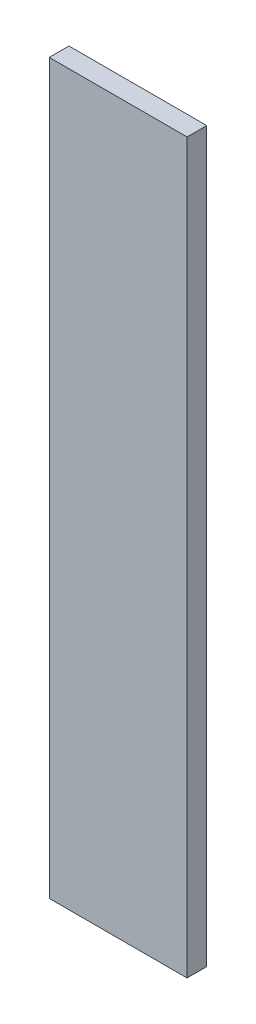
ISO-10303-21;
HEADER;
FILE_DESCRIPTION(('STEP AP214'),'2;1');
FILE_NAME('part.step','',(''),(''),'','','');
FILE_SCHEMA(('AUTOMOTIVE_DESIGN { 1 0 10303 214 1 1 1 1 }'));
ENDSEC;
DATA;
#1=APPLICATION_CONTEXT('core data for automotive mechanical design processes');
#2=APPLICATION_PROTOCOL_DEFINITION('international standard','automotive_design',2000,#1);
#3=PRODUCT_CONTEXT('',#1,'mechanical');
#4=PRODUCT('Part','Part','',(#3));
#5=PRODUCT_RELATED_PRODUCT_CATEGORY('part','',(#4));
#6=PRODUCT_DEFINITION_FORMATION('','',#4);
#7=PRODUCT_DEFINITION_CONTEXT('part definition',#1,'design');
#8=PRODUCT_DEFINITION('design','',#6,#7);
#9=PRODUCT_DEFINITION_SHAPE('','',#8);
#10=(LENGTH_UNIT() NAMED_UNIT(*) SI_UNIT(.MILLI.,.METRE.));
#11=(NAMED_UNIT(*) PLANE_ANGLE_UNIT() SI_UNIT($,.RADIAN.));
#12=(NAMED_UNIT(*) SI_UNIT($,.STERADIAN.) SOLID_ANGLE_UNIT());
#13=UNCERTAINTY_MEASURE_WITH_UNIT(LENGTH_MEASURE(1.E-05),#10,'distance_accuracy_value','');
#14=(GEOMETRIC_REPRESENTATION_CONTEXT(3) GLOBAL_UNCERTAINTY_ASSIGNED_CONTEXT((#13)) GLOBAL_UNIT_ASSIGNED_CONTEXT((#10,
#11,#12)) REPRESENTATION_CONTEXT('',''));
#15=CARTESIAN_POINT('',(0.,0.,0.));
#16=DIRECTION('',(0.,0.,1.));
#17=DIRECTION('',(1.,0.,0.));
#18=AXIS2_PLACEMENT_3D('',#15,#16,#17);
#19=CARTESIAN_POINT('',(0.,-370.,10.));
#20=DIRECTION('',(1.,0.,0.));
#21=DIRECTION('',(0.,0.,-1.));
#22=AXIS2_PLACEMENT_3D('',#19,#20,#21);
#23=PLANE('',#22);
#24=DIRECTION('',(0.,-1.,0.));
#25=VECTOR('',#24,1.);
#26=CARTESIAN_POINT('',(0.,-370.,0.));
#27=LINE('',#26,#25);
#28=CARTESIAN_POINT('',(0.,0.,0.));
#29=VERTEX_POINT('',#28);
#30=CARTESIAN_POINT('',(0.,-370.,0.));
#31=VERTEX_POINT('',#30);
#32=EDGE_CURVE('E107',#29,#31,#27,.T.);
#33=ORIENTED_EDGE('',*,*,#32,.T.);
#34=DIRECTION('',(0.,0.,-1.));
#35=VECTOR('',#34,1.);
#36=CARTESIAN_POINT('',(0.,-370.,10.));
#37=LINE('',#36,#35);
#38=CARTESIAN_POINT('',(0.,-370.,10.));
#39=VERTEX_POINT('',#38);
#40=EDGE_CURVE('E11',#39,#31,#37,.T.);
#41=ORIENTED_EDGE('',*,*,#40,.F.);
#42=DIRECTION('',(0.,-1.,0.));
#43=VECTOR('',#42,1.);
#44=CARTESIAN_POINT('',(0.,-370.,10.));
#45=LINE('',#44,#43);
#46=CARTESIAN_POINT('',(0.,0.,10.));
#47=VERTEX_POINT('',#46);
#48=EDGE_CURVE('E91',#47,#39,#45,.T.);
#49=ORIENTED_EDGE('',*,*,#48,.F.);
#50=DIRECTION('',(0.,0.,-1.));
#51=VECTOR('',#50,1.);
#52=CARTESIAN_POINT('',(0.,0.,10.));
#53=LINE('',#52,#51);
#54=EDGE_CURVE('E103',#47,#29,#53,.T.);
#55=ORIENTED_EDGE('',*,*,#54,.T.);
#56=EDGE_LOOP('',(#33,#41,#49,#55));
#57=FACE_BOUND('',#56,.T.);
#58=ADVANCED_FACE('F39',(#57),#23,.F.);
#59=CARTESIAN_POINT('',(70.,-370.,10.));
#60=DIRECTION('',(0.,1.,0.));
#61=DIRECTION('',(0.,0.,1.));
#62=AXIS2_PLACEMENT_3D('',#59,#60,#61);
#63=PLANE('',#62);
#64=DIRECTION('',(1.,0.,0.));
#65=VECTOR('',#64,1.);
#66=CARTESIAN_POINT('',(70.,-370.,0.));
#67=LINE('',#66,#65);
#68=CARTESIAN_POINT('',(70.,-370.,0.));
#69=VERTEX_POINT('',#68);
#70=EDGE_CURVE('E96',#31,#69,#67,.T.);
#71=ORIENTED_EDGE('',*,*,#70,.T.);
#72=DIRECTION('',(0.,0.,-1.));
#73=VECTOR('',#72,1.);
#74=CARTESIAN_POINT('',(70.,-370.,10.));
#75=LINE('',#74,#73);
#76=CARTESIAN_POINT('',(70.,-370.,10.));
#77=VERTEX_POINT('',#76);
#78=EDGE_CURVE('E48',#77,#69,#75,.T.);
#79=ORIENTED_EDGE('',*,*,#78,.F.);
#80=DIRECTION('',(1.,0.,0.));
#81=VECTOR('',#80,1.);
#82=CARTESIAN_POINT('',(70.,-370.,10.));
#83=LINE('',#82,#81);
#84=EDGE_CURVE('E86',#39,#77,#83,.T.);
#85=ORIENTED_EDGE('',*,*,#84,.F.);
#86=ORIENTED_EDGE('',*,*,#40,.T.);
#87=EDGE_LOOP('',(#71,#79,#85,#86));
#88=FACE_BOUND('',#87,.T.);
#89=ADVANCED_FACE('F95',(#88),#63,.F.);
#90=CARTESIAN_POINT('',(70.,0.,10.));
#91=DIRECTION('',(-1.,0.,0.));
#92=DIRECTION('',(0.,-1.,0.));
#93=AXIS2_PLACEMENT_3D('',#90,#91,#92);
#94=PLANE('',#93);
#95=DIRECTION('',(0.,1.,0.));
#96=VECTOR('',#95,1.);
#97=CARTESIAN_POINT('',(70.,0.,0.));
#98=LINE('',#97,#96);
#99=CARTESIAN_POINT('',(70.,0.,0.));
#100=VERTEX_POINT('',#99);
#101=EDGE_CURVE('E73',#69,#100,#98,.T.);
#102=ORIENTED_EDGE('',*,*,#101,.T.);
#103=DIRECTION('',(0.,0.,-1.));
#104=VECTOR('',#103,1.);
#105=CARTESIAN_POINT('',(70.,0.,10.));
#106=LINE('',#105,#104);
#107=CARTESIAN_POINT('',(70.,0.,10.));
#108=VERTEX_POINT('',#107);
#109=EDGE_CURVE('E98',#108,#100,#106,.T.);
#110=ORIENTED_EDGE('',*,*,#109,.F.);
#111=DIRECTION('',(0.,1.,0.));
#112=VECTOR('',#111,1.);
#113=CARTESIAN_POINT('',(70.,0.,10.));
#114=LINE('',#113,#112);
#115=EDGE_CURVE('E89',#77,#108,#114,.T.);
#116=ORIENTED_EDGE('',*,*,#115,.F.);
#117=ORIENTED_EDGE('',*,*,#78,.T.);
#118=EDGE_LOOP('',(#102,#110,#116,#117));
#119=FACE_BOUND('',#118,.T.);
#120=ADVANCED_FACE('F99',(#119),#94,.F.);
#121=CARTESIAN_POINT('',(0.,0.,10.));
#122=DIRECTION('',(0.,-1.,0.));
#123=DIRECTION('',(0.,0.,-1.));
#124=AXIS2_PLACEMENT_3D('',#121,#122,#123);
#125=PLANE('',#124);
#126=DIRECTION('',(-1.,0.,0.));
#127=VECTOR('',#126,1.);
#128=CARTESIAN_POINT('',(0.,0.,0.));
#129=LINE('',#128,#127);
#130=EDGE_CURVE('E79',#100,#29,#129,.T.);
#131=ORIENTED_EDGE('',*,*,#130,.T.);
#132=ORIENTED_EDGE('',*,*,#54,.F.);
#133=DIRECTION('',(-1.,0.,0.));
#134=VECTOR('',#133,1.);
#135=CARTESIAN_POINT('',(0.,0.,10.));
#136=LINE('',#135,#134);
#137=EDGE_CURVE('E56',#108,#47,#136,.T.);
#138=ORIENTED_EDGE('',*,*,#137,.F.);
#139=ORIENTED_EDGE('',*,*,#109,.T.);
#140=EDGE_LOOP('',(#131,#132,#138,#139));
#141=FACE_BOUND('',#140,.T.);
#142=ADVANCED_FACE('F120',(#141),#125,.F.);
#143=CARTESIAN_POINT('',(0.,0.,10.));
#144=DIRECTION('',(0.,0.,-1.));
#145=DIRECTION('',(-1.,0.,0.));
#146=AXIS2_PLACEMENT_3D('',#143,#144,#145);
#147=PLANE('',#146);
#148=ORIENTED_EDGE('',*,*,#48,.T.);
#149=ORIENTED_EDGE('',*,*,#84,.T.);
#150=ORIENTED_EDGE('',*,*,#115,.T.);
#151=ORIENTED_EDGE('',*,*,#137,.T.);
#152=EDGE_LOOP('',(#148,#149,#150,#151));
#153=FACE_BOUND('',#152,.T.);
#154=ADVANCED_FACE('F87',(#153),#147,.F.);
#155=CARTESIAN_POINT('',(0.,0.,0.));
#156=DIRECTION('',(0.,0.,-1.));
#157=DIRECTION('',(-1.,0.,0.));
#158=AXIS2_PLACEMENT_3D('',#155,#156,#157);
#159=PLANE('',#158);
#160=ORIENTED_EDGE('',*,*,#32,.F.);
#161=ORIENTED_EDGE('',*,*,#130,.F.);
#162=ORIENTED_EDGE('',*,*,#101,.F.);
#163=ORIENTED_EDGE('',*,*,#70,.F.);
#164=EDGE_LOOP('',(#160,#161,#162,#163));
#165=FACE_BOUND('',#164,.T.);
#166=ADVANCED_FACE('F123',(#165),#159,.T.);
#167=CLOSED_SHELL('',(#58,#89,#120,#142,#154,#166));
#168=MANIFOLD_SOLID_BREP('B2',#167);
#169=ADVANCED_BREP_SHAPE_REPRESENTATION('',(#18,#168),#14);
#170=SHAPE_DEFINITION_REPRESENTATION(#9,#169);
ENDSEC;
END-ISO-10303-21;
